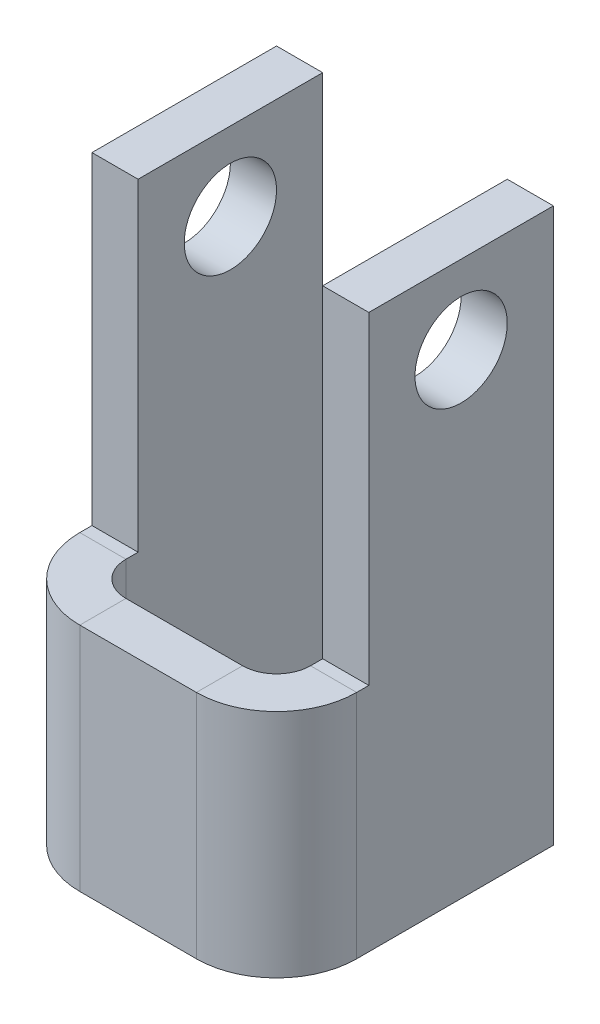
ISO-10303-21;
HEADER;
FILE_DESCRIPTION(('STEP AP214'),'2;1');
FILE_NAME('part.step','',(''),(''),'','','');
FILE_SCHEMA(('AUTOMOTIVE_DESIGN { 1 0 10303 214 1 1 1 1 }'));
ENDSEC;
DATA;
#1=APPLICATION_CONTEXT('core data for automotive mechanical design processes');
#2=APPLICATION_PROTOCOL_DEFINITION('international standard','automotive_design',2000,#1);
#3=PRODUCT_CONTEXT('',#1,'mechanical');
#4=PRODUCT('Part','Part','',(#3));
#5=PRODUCT_RELATED_PRODUCT_CATEGORY('part','',(#4));
#6=PRODUCT_DEFINITION_FORMATION('','',#4);
#7=PRODUCT_DEFINITION_CONTEXT('part definition',#1,'design');
#8=PRODUCT_DEFINITION('design','',#6,#7);
#9=PRODUCT_DEFINITION_SHAPE('','',#8);
#10=(LENGTH_UNIT() NAMED_UNIT(*) SI_UNIT(.MILLI.,.METRE.));
#11=(NAMED_UNIT(*) PLANE_ANGLE_UNIT() SI_UNIT($,.RADIAN.));
#12=(NAMED_UNIT(*) SI_UNIT($,.STERADIAN.) SOLID_ANGLE_UNIT());
#13=UNCERTAINTY_MEASURE_WITH_UNIT(LENGTH_MEASURE(1.E-05),#10,'distance_accuracy_value','');
#14=(GEOMETRIC_REPRESENTATION_CONTEXT(3) GLOBAL_UNCERTAINTY_ASSIGNED_CONTEXT((#13)) GLOBAL_UNIT_ASSIGNED_CONTEXT((#10,
#11,#12)) REPRESENTATION_CONTEXT('',''));
#15=CARTESIAN_POINT('',(0.,0.,0.));
#16=DIRECTION('',(0.,0.,1.));
#17=DIRECTION('',(1.,0.,0.));
#18=AXIS2_PLACEMENT_3D('',#15,#16,#17);
#19=CARTESIAN_POINT('',(-4.,5.,-2.00000000000003));
#20=DIRECTION('',(0.,-1.,0.));
#21=DIRECTION('',(0.,0.,-1.));
#22=AXIS2_PLACEMENT_3D('',#19,#20,#21);
#23=PLANE('',#22);
#24=DIRECTION('',(0.,0.,-1.));
#25=VECTOR('',#24,1.);
#26=CARTESIAN_POINT('',(0.,5.,0.));
#27=LINE('',#26,#25);
#28=CARTESIAN_POINT('',(0.,5.,-1.73659999999999));
#29=VERTEX_POINT('',#28);
#30=CARTESIAN_POINT('',(0.,5.,-2.00000000000001));
#31=VERTEX_POINT('',#30);
#32=EDGE_CURVE('E288',#29,#31,#27,.T.);
#33=ORIENTED_EDGE('',*,*,#32,.F.);
#34=DIRECTION('',(1.,0.,0.));
#35=VECTOR('',#34,1.);
#36=CARTESIAN_POINT('',(0.,5.,-1.73659999999999));
#37=LINE('',#36,#35);
#38=CARTESIAN_POINT('',(0.999999999999997,5.,-1.7366));
#39=VERTEX_POINT('',#38);
#40=EDGE_CURVE('E13',#29,#39,#37,.T.);
#41=ORIENTED_EDGE('',*,*,#40,.T.);
#42=DIRECTION('',(0.,0.,-1.));
#43=VECTOR('',#42,1.);
#44=CARTESIAN_POINT('',(1.,5.,0.));
#45=LINE('',#44,#43);
#46=CARTESIAN_POINT('',(0.999999999999997,5.,-2.00000000000001));
#47=VERTEX_POINT('',#46);
#48=EDGE_CURVE('E259',#39,#47,#45,.T.);
#49=ORIENTED_EDGE('',*,*,#48,.T.);
#50=DIRECTION('',(1.,0.,0.));
#51=VECTOR('',#50,1.);
#52=CARTESIAN_POINT('',(-4.,5.,-2.00000000000003));
#53=LINE('',#52,#51);
#54=EDGE_CURVE('E388',#31,#47,#53,.T.);
#55=ORIENTED_EDGE('',*,*,#54,.F.);
#56=EDGE_LOOP('',(#33,#41,#49,#55));
#57=FACE_BOUND('',#56,.T.);
#58=ADVANCED_FACE('F80',(#57),#23,.F.);
#59=DIRECTION('',(-1.,0.,0.));
#60=VECTOR('',#59,1.);
#61=CARTESIAN_POINT('',(0.,5.,-1.));
#62=LINE('',#61,#60);
#63=CARTESIAN_POINT('',(4.2634,5.,-1.));
#64=VERTEX_POINT('',#63);
#65=CARTESIAN_POINT('',(1.7366,5.,-1.));
#66=VERTEX_POINT('',#65);
#67=EDGE_CURVE('E278',#64,#66,#62,.T.);
#68=ORIENTED_EDGE('',*,*,#67,.T.);
#69=DIRECTION('',(0.,0.,1.));
#70=VECTOR('',#69,1.);
#71=CARTESIAN_POINT('',(1.7366,5.,-1.));
#72=LINE('',#71,#70);
#73=CARTESIAN_POINT('',(1.73659999999999,5.,0.));
#74=VERTEX_POINT('',#73);
#75=EDGE_CURVE('E89',#66,#74,#72,.T.);
#76=ORIENTED_EDGE('',*,*,#75,.T.);
#77=DIRECTION('',(1.,0.,0.));
#78=VECTOR('',#77,1.);
#79=CARTESIAN_POINT('',(-4.,5.,0.));
#80=LINE('',#79,#78);
#81=CARTESIAN_POINT('',(4.2634,5.,0.));
#82=VERTEX_POINT('',#81);
#83=EDGE_CURVE('E275',#74,#82,#80,.T.);
#84=ORIENTED_EDGE('',*,*,#83,.T.);
#85=DIRECTION('',(0.,0.,-1.));
#86=VECTOR('',#85,1.);
#87=CARTESIAN_POINT('',(4.2634,5.,0.));
#88=LINE('',#87,#86);
#89=EDGE_CURVE('E265',#82,#64,#88,.T.);
#90=ORIENTED_EDGE('',*,*,#89,.T.);
#91=EDGE_LOOP('',(#68,#76,#84,#90));
#92=FACE_BOUND('',#91,.T.);
#93=ADVANCED_FACE('F273',(#92),#23,.F.);
#94=DIRECTION('',(0.,0.,1.));
#95=VECTOR('',#94,1.);
#96=CARTESIAN_POINT('',(5.,5.,0.));
#97=LINE('',#96,#95);
#98=CARTESIAN_POINT('',(5.,5.,-2.));
#99=VERTEX_POINT('',#98);
#100=CARTESIAN_POINT('',(5.,5.,-1.7366));
#101=VERTEX_POINT('',#100);
#102=EDGE_CURVE('E329',#99,#101,#97,.T.);
#103=ORIENTED_EDGE('',*,*,#102,.T.);
#104=DIRECTION('',(1.,0.,0.));
#105=VECTOR('',#104,1.);
#106=CARTESIAN_POINT('',(5.,5.,-1.7366));
#107=LINE('',#106,#105);
#108=CARTESIAN_POINT('',(6.,5.,-1.73659999999999));
#109=VERTEX_POINT('',#108);
#110=EDGE_CURVE('E267',#101,#109,#107,.T.);
#111=ORIENTED_EDGE('',*,*,#110,.T.);
#112=DIRECTION('',(0.,0.,-1.));
#113=VECTOR('',#112,1.);
#114=CARTESIAN_POINT('',(6.,5.,-1.99999999999999));
#115=LINE('',#114,#113);
#116=CARTESIAN_POINT('',(6.,5.,-1.99999999999999));
#117=VERTEX_POINT('',#116);
#118=EDGE_CURVE('E203',#109,#117,#115,.T.);
#119=ORIENTED_EDGE('',*,*,#118,.T.);
#120=EDGE_CURVE('E198',#99,#117,#53,.T.);
#121=ORIENTED_EDGE('',*,*,#120,.F.);
#122=EDGE_LOOP('',(#103,#111,#119,#121));
#123=FACE_BOUND('',#122,.T.);
#124=ADVANCED_FACE('F429',(#123),#23,.F.);
#125=ORIENTED_EDGE('',*,*,#40,.F.);
#126=CARTESIAN_POINT('',(1.7366,5.,-1.7366));
#127=DIRECTION('',(0.,-1.,0.));
#128=DIRECTION('',(0.,0.,-1.));
#129=AXIS2_PLACEMENT_3D('',#126,#127,#128);
#130=CIRCLE('',#129,1.7366);
#131=EDGE_CURVE('E282',#29,#74,#130,.F.);
#132=ORIENTED_EDGE('',*,*,#131,.T.);
#133=ORIENTED_EDGE('',*,*,#75,.F.);
#134=CARTESIAN_POINT('',(1.7366,5.,-1.7366));
#135=DIRECTION('',(0.,-1.,0.));
#136=DIRECTION('',(0.,0.,-1.));
#137=AXIS2_PLACEMENT_3D('',#134,#135,#136);
#138=CIRCLE('',#137,0.7366);
#139=EDGE_CURVE('E362',#39,#66,#138,.F.);
#140=ORIENTED_EDGE('',*,*,#139,.F.);
#141=EDGE_LOOP('',(#125,#132,#133,#140));
#142=FACE_BOUND('',#141,.T.);
#143=ADVANCED_FACE('F283',(#142),#23,.F.);
#144=CARTESIAN_POINT('',(0.,0.,-1.));
#145=DIRECTION('',(0.,0.,-1.));
#146=DIRECTION('',(-1.,0.,0.));
#147=AXIS2_PLACEMENT_3D('',#144,#145,#146);
#148=PLANE('',#147);
#149=ORIENTED_EDGE('',*,*,#67,.F.);
#150=DIRECTION('',(0.,-1.,0.));
#151=VECTOR('',#150,1.);
#152=CARTESIAN_POINT('',(4.2634,0.,-0.999999999999999));
#153=LINE('',#152,#151);
#154=CARTESIAN_POINT('',(4.2634,0.,-1.));
#155=VERTEX_POINT('',#154);
#156=EDGE_CURVE('E250',#155,#64,#153,.F.);
#157=ORIENTED_EDGE('',*,*,#156,.F.);
#158=DIRECTION('',(1.,0.,0.));
#159=VECTOR('',#158,1.);
#160=CARTESIAN_POINT('',(0.,0.,-1.));
#161=LINE('',#160,#159);
#162=CARTESIAN_POINT('',(1.7366,0.,-1.));
#163=VERTEX_POINT('',#162);
#164=EDGE_CURVE('E102',#163,#155,#161,.T.);
#165=ORIENTED_EDGE('',*,*,#164,.F.);
#166=DIRECTION('',(0.,1.,0.));
#167=VECTOR('',#166,1.);
#168=CARTESIAN_POINT('',(1.7366,12.,-1.));
#169=LINE('',#168,#167);
#170=EDGE_CURVE('E304',#66,#163,#169,.F.);
#171=ORIENTED_EDGE('',*,*,#170,.F.);
#172=EDGE_LOOP('',(#149,#157,#165,#171));
#173=FACE_BOUND('',#172,.T.);
#174=ADVANCED_FACE('F411',(#173),#148,.T.);
#175=CARTESIAN_POINT('',(0.,0.,0.));
#176=DIRECTION('',(0.,0.,-1.));
#177=DIRECTION('',(-1.,0.,0.));
#178=AXIS2_PLACEMENT_3D('',#175,#176,#177);
#179=PLANE('',#178);
#180=DIRECTION('',(0.,-1.,0.));
#181=VECTOR('',#180,1.);
#182=CARTESIAN_POINT('',(4.2634,0.,0.));
#183=LINE('',#182,#181);
#184=CARTESIAN_POINT('',(4.2634,0.,0.));
#185=VERTEX_POINT('',#184);
#186=EDGE_CURVE('E243',#185,#82,#183,.F.);
#187=ORIENTED_EDGE('',*,*,#186,.T.);
#188=ORIENTED_EDGE('',*,*,#83,.F.);
#189=DIRECTION('',(0.,1.,0.));
#190=VECTOR('',#189,1.);
#191=CARTESIAN_POINT('',(1.7366,12.,0.));
#192=LINE('',#191,#190);
#193=CARTESIAN_POINT('',(1.7366,0.,0.));
#194=VERTEX_POINT('',#193);
#195=EDGE_CURVE('E292',#74,#194,#192,.F.);
#196=ORIENTED_EDGE('',*,*,#195,.T.);
#197=DIRECTION('',(1.,0.,0.));
#198=VECTOR('',#197,1.);
#199=CARTESIAN_POINT('',(0.,0.,0.));
#200=LINE('',#199,#198);
#201=EDGE_CURVE('E257',#194,#185,#200,.T.);
#202=ORIENTED_EDGE('',*,*,#201,.T.);
#203=EDGE_LOOP('',(#187,#188,#196,#202));
#204=FACE_BOUND('',#203,.T.);
#205=ADVANCED_FACE('F291',(#204),#179,.F.);
#206=CARTESIAN_POINT('',(0.,0.,-1.));
#207=DIRECTION('',(0.,-1.,0.));
#208=DIRECTION('',(0.,0.,-1.));
#209=AXIS2_PLACEMENT_3D('',#206,#207,#208);
#210=PLANE('',#209);
#211=DIRECTION('',(0.,0.,1.));
#212=VECTOR('',#211,1.);
#213=CARTESIAN_POINT('',(1.7366,0.,-1.));
#214=LINE('',#213,#212);
#215=EDGE_CURVE('E242',#163,#194,#214,.T.);
#216=ORIENTED_EDGE('',*,*,#215,.F.);
#217=ORIENTED_EDGE('',*,*,#164,.T.);
#218=DIRECTION('',(0.,0.,1.));
#219=VECTOR('',#218,1.);
#220=CARTESIAN_POINT('',(4.2634,0.,-0.999999999999999));
#221=LINE('',#220,#219);
#222=EDGE_CURVE('E246',#155,#185,#221,.T.);
#223=ORIENTED_EDGE('',*,*,#222,.T.);
#224=ORIENTED_EDGE('',*,*,#201,.F.);
#225=EDGE_LOOP('',(#216,#217,#223,#224));
#226=FACE_BOUND('',#225,.T.);
#227=ADVANCED_FACE('F82',(#226),#210,.T.);
#228=CARTESIAN_POINT('',(4.2634,0.,-1.7366));
#229=DIRECTION('',(0.,1.,0.));
#230=DIRECTION('',(0.,0.,1.));
#231=AXIS2_PLACEMENT_3D('',#228,#229,#230);
#232=PLANE('',#231);
#233=CARTESIAN_POINT('',(4.2634,0.,-1.7366));
#234=DIRECTION('',(0.,-1.,0.));
#235=DIRECTION('',(0.,0.,-1.));
#236=AXIS2_PLACEMENT_3D('',#233,#234,#235);
#237=CIRCLE('',#236,0.7366);
#238=CARTESIAN_POINT('',(5.,0.,-1.7366));
#239=VERTEX_POINT('',#238);
#240=EDGE_CURVE('E253',#239,#155,#237,.T.);
#241=ORIENTED_EDGE('',*,*,#240,.F.);
#242=DIRECTION('',(-1.,0.,0.));
#243=VECTOR('',#242,1.);
#244=CARTESIAN_POINT('',(5.,0.,-1.7366));
#245=LINE('',#244,#243);
#246=CARTESIAN_POINT('',(6.,0.,-1.73659999999999));
#247=VERTEX_POINT('',#246);
#248=EDGE_CURVE('E237',#239,#247,#245,.F.);
#249=ORIENTED_EDGE('',*,*,#248,.T.);
#250=CARTESIAN_POINT('',(4.2634,0.,-1.7366));
#251=DIRECTION('',(0.,-1.,0.));
#252=DIRECTION('',(0.,0.,-1.));
#253=AXIS2_PLACEMENT_3D('',#250,#251,#252);
#254=CIRCLE('',#253,1.7366);
#255=EDGE_CURVE('E247',#247,#185,#254,.T.);
#256=ORIENTED_EDGE('',*,*,#255,.T.);
#257=ORIENTED_EDGE('',*,*,#222,.F.);
#258=EDGE_LOOP('',(#241,#249,#256,#257));
#259=FACE_BOUND('',#258,.T.);
#260=ADVANCED_FACE('F407',(#259),#232,.F.);
#261=CARTESIAN_POINT('',(4.2634,0.,-1.7366));
#262=DIRECTION('',(0.,-1.,0.));
#263=DIRECTION('',(1.,0.,0.));
#264=AXIS2_PLACEMENT_3D('',#261,#262,#263);
#265=CYLINDRICAL_SURFACE('',#264,1.7366);
#266=CARTESIAN_POINT('',(4.2634,5.,-1.7366));
#267=DIRECTION('',(0.,-1.,0.));
#268=DIRECTION('',(0.,0.,-1.));
#269=AXIS2_PLACEMENT_3D('',#266,#267,#268);
#270=CIRCLE('',#269,1.7366);
#271=EDGE_CURVE('E287',#82,#109,#270,.F.);
#272=ORIENTED_EDGE('',*,*,#271,.F.);
#273=ORIENTED_EDGE('',*,*,#186,.F.);
#274=ORIENTED_EDGE('',*,*,#255,.F.);
#275=DIRECTION('',(0.,-1.,0.));
#276=VECTOR('',#275,1.);
#277=CARTESIAN_POINT('',(6.,12.,-1.73659999999999));
#278=LINE('',#277,#276);
#279=EDGE_CURVE('E234',#247,#109,#278,.F.);
#280=ORIENTED_EDGE('',*,*,#279,.T.);
#281=EDGE_LOOP('',(#272,#273,#274,#280));
#282=FACE_BOUND('',#281,.T.);
#283=ADVANCED_FACE('F403',(#282),#265,.T.);
#284=CARTESIAN_POINT('',(4.2634,0.,-1.7366));
#285=DIRECTION('',(0.,-1.,0.));
#286=DIRECTION('',(1.,0.,0.));
#287=AXIS2_PLACEMENT_3D('',#284,#285,#286);
#288=CYLINDRICAL_SURFACE('',#287,0.7366);
#289=ORIENTED_EDGE('',*,*,#156,.T.);
#290=CARTESIAN_POINT('',(4.2634,5.,-1.7366));
#291=DIRECTION('',(0.,-1.,0.));
#292=DIRECTION('',(0.,0.,-1.));
#293=AXIS2_PLACEMENT_3D('',#290,#291,#292);
#294=CIRCLE('',#293,0.7366);
#295=EDGE_CURVE('E390',#64,#101,#294,.F.);
#296=ORIENTED_EDGE('',*,*,#295,.T.);
#297=DIRECTION('',(0.,-1.,0.));
#298=VECTOR('',#297,1.);
#299=CARTESIAN_POINT('',(5.,12.,-1.7366));
#300=LINE('',#299,#298);
#301=EDGE_CURVE('E240',#101,#239,#300,.T.);
#302=ORIENTED_EDGE('',*,*,#301,.T.);
#303=ORIENTED_EDGE('',*,*,#240,.T.);
#304=EDGE_LOOP('',(#289,#296,#302,#303));
#305=FACE_BOUND('',#304,.T.);
#306=ADVANCED_FACE('F409',(#305),#288,.F.);
#307=CARTESIAN_POINT('',(6.00000000000002,0.,-6.));
#308=DIRECTION('',(0.,1.,0.));
#309=DIRECTION('',(0.,0.,1.));
#310=AXIS2_PLACEMENT_3D('',#307,#308,#309);
#311=PLANE('',#310);
#312=ORIENTED_EDGE('',*,*,#248,.F.);
#313=DIRECTION('',(0.,0.,1.));
#314=VECTOR('',#313,1.);
#315=CARTESIAN_POINT('',(5.00000000000002,0.,-6.));
#316=LINE('',#315,#314);
#317=CARTESIAN_POINT('',(5.00000000000002,0.,-6.));
#318=VERTEX_POINT('',#317);
#319=EDGE_CURVE('E232',#239,#318,#316,.F.);
#320=ORIENTED_EDGE('',*,*,#319,.T.);
#321=DIRECTION('',(-1.,0.,0.));
#322=VECTOR('',#321,1.);
#323=CARTESIAN_POINT('',(6.00000000000002,0.,-6.));
#324=LINE('',#323,#322);
#325=CARTESIAN_POINT('',(6.00000000000002,0.,-6.));
#326=VERTEX_POINT('',#325);
#327=EDGE_CURVE('E222',#326,#318,#324,.T.);
#328=ORIENTED_EDGE('',*,*,#327,.F.);
#329=DIRECTION('',(0.,0.,-1.));
#330=VECTOR('',#329,1.);
#331=CARTESIAN_POINT('',(6.,0.,0.));
#332=LINE('',#331,#330);
#333=EDGE_CURVE('E224',#247,#326,#332,.T.);
#334=ORIENTED_EDGE('',*,*,#333,.F.);
#335=EDGE_LOOP('',(#312,#320,#328,#334));
#336=FACE_BOUND('',#335,.T.);
#337=ADVANCED_FACE('F321',(#336),#311,.F.);
#338=CARTESIAN_POINT('',(6.,12.,-0.999999999999997));
#339=DIRECTION('',(0.,-1.,0.));
#340=DIRECTION('',(0.,0.,-1.));
#341=AXIS2_PLACEMENT_3D('',#338,#339,#340);
#342=PLANE('',#341);
#343=DIRECTION('',(0.,0.,-1.));
#344=VECTOR('',#343,1.);
#345=CARTESIAN_POINT('',(5.,12.,-1.));
#346=LINE('',#345,#344);
#347=CARTESIAN_POINT('',(5.00000000000002,12.,-6.));
#348=VERTEX_POINT('',#347);
#349=CARTESIAN_POINT('',(5.,12.,-2.));
#350=VERTEX_POINT('',#349);
#351=EDGE_CURVE('E213',#348,#350,#346,.F.);
#352=ORIENTED_EDGE('',*,*,#351,.T.);
#353=DIRECTION('',(1.,0.,0.));
#354=VECTOR('',#353,1.);
#355=CARTESIAN_POINT('',(-4.,12.,-2.00000000000003));
#356=LINE('',#355,#354);
#357=CARTESIAN_POINT('',(6.,12.,-1.99999999999999));
#358=VERTEX_POINT('',#357);
#359=EDGE_CURVE('E195',#350,#358,#356,.T.);
#360=ORIENTED_EDGE('',*,*,#359,.T.);
#361=DIRECTION('',(0.,0.,1.));
#362=VECTOR('',#361,1.);
#363=CARTESIAN_POINT('',(6.,12.,0.));
#364=LINE('',#363,#362);
#365=CARTESIAN_POINT('',(6.00000000000002,12.,-6.));
#366=VERTEX_POINT('',#365);
#367=EDGE_CURVE('E211',#366,#358,#364,.T.);
#368=ORIENTED_EDGE('',*,*,#367,.F.);
#369=DIRECTION('',(-1.,0.,0.));
#370=VECTOR('',#369,1.);
#371=CARTESIAN_POINT('',(6.00000000000002,12.,-6.));
#372=LINE('',#371,#370);
#373=EDGE_CURVE('E220',#366,#348,#372,.T.);
#374=ORIENTED_EDGE('',*,*,#373,.T.);
#375=EDGE_LOOP('',(#352,#360,#368,#374));
#376=FACE_BOUND('',#375,.T.);
#377=ADVANCED_FACE('F209',(#376),#342,.F.);
#378=CARTESIAN_POINT('',(6.,0.,0.));
#379=DIRECTION('',(-1.,0.,0.));
#380=DIRECTION('',(0.,0.,1.));
#381=AXIS2_PLACEMENT_3D('',#378,#379,#380);
#382=PLANE('',#381);
#383=CARTESIAN_POINT('',(6.00000000000001,10.3,-4.));
#384=DIRECTION('',(1.,0.,0.));
#385=DIRECTION('',(0.,0.,-1.));
#386=AXIS2_PLACEMENT_3D('',#383,#384,#385);
#387=CIRCLE('',#386,1.);
#388=CARTESIAN_POINT('',(6.00000000000001,10.3,-5.));
#389=VERTEX_POINT('',#388);
#390=EDGE_CURVE('E456',#389,#389,#387,.T.);
#391=ORIENTED_EDGE('',*,*,#390,.F.);
#392=EDGE_LOOP('',(#391));
#393=FACE_BOUND('',#392,.T.);
#394=ORIENTED_EDGE('',*,*,#367,.T.);
#395=DIRECTION('',(0.,1.,0.));
#396=VECTOR('',#395,1.);
#397=CARTESIAN_POINT('',(6.,12.,-1.99999999999999));
#398=LINE('',#397,#396);
#399=EDGE_CURVE('E192',#117,#358,#398,.T.);
#400=ORIENTED_EDGE('',*,*,#399,.F.);
#401=ORIENTED_EDGE('',*,*,#118,.F.);
#402=ORIENTED_EDGE('',*,*,#279,.F.);
#403=ORIENTED_EDGE('',*,*,#333,.T.);
#404=DIRECTION('',(0.,1.,0.));
#405=VECTOR('',#404,1.);
#406=CARTESIAN_POINT('',(6.00000000000002,0.,-6.));
#407=LINE('',#406,#405);
#408=EDGE_CURVE('E218',#326,#366,#407,.T.);
#409=ORIENTED_EDGE('',*,*,#408,.T.);
#410=EDGE_LOOP('',(#394,#400,#401,#402,#403,#409));
#411=FACE_BOUND('',#410,.T.);
#412=ADVANCED_FACE('F216',(#393,#411),#382,.F.);
#413=CARTESIAN_POINT('',(5.,0.,0.));
#414=DIRECTION('',(-1.,0.,0.));
#415=DIRECTION('',(0.,0.,1.));
#416=AXIS2_PLACEMENT_3D('',#413,#414,#415);
#417=PLANE('',#416);
#418=CARTESIAN_POINT('',(5.00000000000001,10.3,-4.));
#419=DIRECTION('',(-1.,0.,0.));
#420=DIRECTION('',(0.,0.,1.));
#421=AXIS2_PLACEMENT_3D('',#418,#419,#420);
#422=CIRCLE('',#421,1.);
#423=CARTESIAN_POINT('',(5.00000000000001,10.3,-3.));
#424=VERTEX_POINT('',#423);
#425=EDGE_CURVE('E204',#424,#424,#422,.T.);
#426=ORIENTED_EDGE('',*,*,#425,.F.);
#427=EDGE_LOOP('',(#426));
#428=FACE_BOUND('',#427,.T.);
#429=DIRECTION('',(0.,-1.,0.));
#430=VECTOR('',#429,1.);
#431=CARTESIAN_POINT('',(5.,0.,-2.));
#432=LINE('',#431,#430);
#433=EDGE_CURVE('E327',#350,#99,#432,.T.);
#434=ORIENTED_EDGE('',*,*,#433,.F.);
#435=ORIENTED_EDGE('',*,*,#351,.F.);
#436=DIRECTION('',(0.,-1.,0.));
#437=VECTOR('',#436,1.);
#438=CARTESIAN_POINT('',(5.00000000000002,12.,-6.));
#439=LINE('',#438,#437);
#440=EDGE_CURVE('E230',#318,#348,#439,.F.);
#441=ORIENTED_EDGE('',*,*,#440,.F.);
#442=ORIENTED_EDGE('',*,*,#319,.F.);
#443=ORIENTED_EDGE('',*,*,#301,.F.);
#444=ORIENTED_EDGE('',*,*,#102,.F.);
#445=EDGE_LOOP('',(#434,#435,#441,#442,#443,#444));
#446=FACE_BOUND('',#445,.T.);
#447=ADVANCED_FACE('F325',(#428,#446),#417,.T.);
#448=CARTESIAN_POINT('',(6.00000000000002,12.,-6.));
#449=DIRECTION('',(0.,0.,1.));
#450=DIRECTION('',(1.,0.,0.));
#451=AXIS2_PLACEMENT_3D('',#448,#449,#450);
#452=PLANE('',#451);
#453=ORIENTED_EDGE('',*,*,#440,.T.);
#454=ORIENTED_EDGE('',*,*,#373,.F.);
#455=ORIENTED_EDGE('',*,*,#408,.F.);
#456=ORIENTED_EDGE('',*,*,#327,.T.);
#457=EDGE_LOOP('',(#453,#454,#455,#456));
#458=FACE_BOUND('',#457,.T.);
#459=ADVANCED_FACE('F316',(#458),#452,.F.);
#460=CARTESIAN_POINT('',(1.7366,0.,-1.7366));
#461=DIRECTION('',(0.,-1.,0.));
#462=DIRECTION('',(0.,0.,-1.));
#463=AXIS2_PLACEMENT_3D('',#460,#461,#462);
#464=PLANE('',#463);
#465=DIRECTION('',(1.,0.,0.));
#466=VECTOR('',#465,1.);
#467=CARTESIAN_POINT('',(0.,0.,-1.73659999999999));
#468=LINE('',#467,#466);
#469=CARTESIAN_POINT('',(0.999999999999997,0.,-1.7366));
#470=VERTEX_POINT('',#469);
#471=CARTESIAN_POINT('',(0.,0.,-1.73659999999999));
#472=VERTEX_POINT('',#471);
#473=EDGE_CURVE('E307',#470,#472,#468,.F.);
#474=ORIENTED_EDGE('',*,*,#473,.F.);
#475=CARTESIAN_POINT('',(1.7366,0.,-1.7366));
#476=DIRECTION('',(0.,1.,0.));
#477=DIRECTION('',(0.,0.,1.));
#478=AXIS2_PLACEMENT_3D('',#475,#476,#477);
#479=CIRCLE('',#478,0.7366);
#480=EDGE_CURVE('E300',#163,#470,#479,.F.);
#481=ORIENTED_EDGE('',*,*,#480,.F.);
#482=ORIENTED_EDGE('',*,*,#215,.T.);
#483=CARTESIAN_POINT('',(1.7366,0.,-1.7366));
#484=DIRECTION('',(0.,1.,0.));
#485=DIRECTION('',(0.,0.,1.));
#486=AXIS2_PLACEMENT_3D('',#483,#484,#485);
#487=CIRCLE('',#486,1.7366);
#488=EDGE_CURVE('E299',#194,#472,#487,.F.);
#489=ORIENTED_EDGE('',*,*,#488,.T.);
#490=EDGE_LOOP('',(#474,#481,#482,#489));
#491=FACE_BOUND('',#490,.T.);
#492=ADVANCED_FACE('F413',(#491),#464,.T.);
#493=CARTESIAN_POINT('',(1.7366,12.,-1.7366));
#494=DIRECTION('',(0.,1.,0.));
#495=DIRECTION('',(-1.,0.,0.));
#496=AXIS2_PLACEMENT_3D('',#493,#494,#495);
#497=CYLINDRICAL_SURFACE('',#496,1.7366);
#498=ORIENTED_EDGE('',*,*,#131,.F.);
#499=DIRECTION('',(0.,1.,0.));
#500=VECTOR('',#499,1.);
#501=CARTESIAN_POINT('',(0.,0.,-1.73659999999999));
#502=LINE('',#501,#500);
#503=EDGE_CURVE('E357',#29,#472,#502,.F.);
#504=ORIENTED_EDGE('',*,*,#503,.T.);
#505=ORIENTED_EDGE('',*,*,#488,.F.);
#506=ORIENTED_EDGE('',*,*,#195,.F.);
#507=EDGE_LOOP('',(#498,#504,#505,#506));
#508=FACE_BOUND('',#507,.T.);
#509=ADVANCED_FACE('F297',(#508),#497,.T.);
#510=CARTESIAN_POINT('',(1.7366,12.,-1.7366));
#511=DIRECTION('',(0.,1.,0.));
#512=DIRECTION('',(-1.,0.,0.));
#513=AXIS2_PLACEMENT_3D('',#510,#511,#512);
#514=CYLINDRICAL_SURFACE('',#513,0.7366);
#515=DIRECTION('',(0.,1.,0.));
#516=VECTOR('',#515,1.);
#517=CARTESIAN_POINT('',(0.999999999999997,0.,-1.7366));
#518=LINE('',#517,#516);
#519=EDGE_CURVE('E333',#470,#39,#518,.T.);
#520=ORIENTED_EDGE('',*,*,#519,.T.);
#521=ORIENTED_EDGE('',*,*,#139,.T.);
#522=ORIENTED_EDGE('',*,*,#170,.T.);
#523=ORIENTED_EDGE('',*,*,#480,.T.);
#524=EDGE_LOOP('',(#520,#521,#522,#523));
#525=FACE_BOUND('',#524,.T.);
#526=ADVANCED_FACE('F361',(#525),#514,.F.);
#527=CARTESIAN_POINT('',(0.,12.,-6.));
#528=DIRECTION('',(0.,-1.,0.));
#529=DIRECTION('',(0.,0.,-1.));
#530=AXIS2_PLACEMENT_3D('',#527,#528,#529);
#531=PLANE('',#530);
#532=DIRECTION('',(0.,0.,-1.));
#533=VECTOR('',#532,1.);
#534=CARTESIAN_POINT('',(0.,12.,0.));
#535=LINE('',#534,#533);
#536=CARTESIAN_POINT('',(0.,12.,-2.00000000000001));
#537=VERTEX_POINT('',#536);
#538=CARTESIAN_POINT('',(0.,12.,-6.));
#539=VERTEX_POINT('',#538);
#540=EDGE_CURVE('E348',#537,#539,#535,.T.);
#541=ORIENTED_EDGE('',*,*,#540,.F.);
#542=CARTESIAN_POINT('',(0.999999999999997,12.,-2.00000000000001));
#543=VERTEX_POINT('',#542);
#544=EDGE_CURVE('E214',#537,#543,#356,.T.);
#545=ORIENTED_EDGE('',*,*,#544,.T.);
#546=DIRECTION('',(0.,0.,1.));
#547=VECTOR('',#546,1.);
#548=CARTESIAN_POINT('',(0.999999999999982,12.,-6.));
#549=LINE('',#548,#547);
#550=CARTESIAN_POINT('',(0.999999999999982,12.,-6.));
#551=VERTEX_POINT('',#550);
#552=EDGE_CURVE('E355',#543,#551,#549,.F.);
#553=ORIENTED_EDGE('',*,*,#552,.T.);
#554=DIRECTION('',(1.,0.,0.));
#555=VECTOR('',#554,1.);
#556=CARTESIAN_POINT('',(0.,12.,-6.));
#557=LINE('',#556,#555);
#558=EDGE_CURVE('E311',#539,#551,#557,.T.);
#559=ORIENTED_EDGE('',*,*,#558,.F.);
#560=EDGE_LOOP('',(#541,#545,#553,#559));
#561=FACE_BOUND('',#560,.T.);
#562=ADVANCED_FACE('F383',(#561),#531,.F.);
#563=CARTESIAN_POINT('',(0.,0.,-0.999999999999997));
#564=DIRECTION('',(0.,1.,0.));
#565=DIRECTION('',(0.,0.,1.));
#566=AXIS2_PLACEMENT_3D('',#563,#564,#565);
#567=PLANE('',#566);
#568=ORIENTED_EDGE('',*,*,#473,.T.);
#569=DIRECTION('',(0.,0.,1.));
#570=VECTOR('',#569,1.);
#571=CARTESIAN_POINT('',(0.,0.,0.));
#572=LINE('',#571,#570);
#573=CARTESIAN_POINT('',(0.,0.,-6.));
#574=VERTEX_POINT('',#573);
#575=EDGE_CURVE('E343',#574,#472,#572,.T.);
#576=ORIENTED_EDGE('',*,*,#575,.F.);
#577=DIRECTION('',(1.,0.,0.));
#578=VECTOR('',#577,1.);
#579=CARTESIAN_POINT('',(0.,0.,-6.));
#580=LINE('',#579,#578);
#581=CARTESIAN_POINT('',(0.999999999999982,0.,-6.));
#582=VERTEX_POINT('',#581);
#583=EDGE_CURVE('E340',#574,#582,#580,.T.);
#584=ORIENTED_EDGE('',*,*,#583,.T.);
#585=DIRECTION('',(0.,0.,-1.));
#586=VECTOR('',#585,1.);
#587=CARTESIAN_POINT('',(1.,0.,-1.));
#588=LINE('',#587,#586);
#589=EDGE_CURVE('E350',#582,#470,#588,.F.);
#590=ORIENTED_EDGE('',*,*,#589,.T.);
#591=EDGE_LOOP('',(#568,#576,#584,#590));
#592=FACE_BOUND('',#591,.T.);
#593=ADVANCED_FACE('F372',(#592),#567,.F.);
#594=CARTESIAN_POINT('',(0.,0.,0.));
#595=DIRECTION('',(1.,0.,0.));
#596=DIRECTION('',(0.,0.,-1.));
#597=AXIS2_PLACEMENT_3D('',#594,#595,#596);
#598=PLANE('',#597);
#599=CARTESIAN_POINT('',(0.,10.3,-4.00000000000002));
#600=DIRECTION('',(1.,0.,0.));
#601=DIRECTION('',(0.,0.,-1.));
#602=AXIS2_PLACEMENT_3D('',#599,#600,#601);
#603=CIRCLE('',#602,1.);
#604=CARTESIAN_POINT('',(0.,10.3,-5.00000000000002));
#605=VERTEX_POINT('',#604);
#606=EDGE_CURVE('E453',#605,#605,#603,.F.);
#607=ORIENTED_EDGE('',*,*,#606,.F.);
#608=EDGE_LOOP('',(#607));
#609=FACE_BOUND('',#608,.T.);
#610=ORIENTED_EDGE('',*,*,#32,.T.);
#611=DIRECTION('',(0.,1.,0.));
#612=VECTOR('',#611,1.);
#613=CARTESIAN_POINT('',(0.,0.,-2.00000000000002));
#614=LINE('',#613,#612);
#615=EDGE_CURVE('E330',#31,#537,#614,.T.);
#616=ORIENTED_EDGE('',*,*,#615,.T.);
#617=ORIENTED_EDGE('',*,*,#540,.T.);
#618=DIRECTION('',(0.,-1.,0.));
#619=VECTOR('',#618,1.);
#620=CARTESIAN_POINT('',(0.,0.,-6.));
#621=LINE('',#620,#619);
#622=EDGE_CURVE('E346',#539,#574,#621,.T.);
#623=ORIENTED_EDGE('',*,*,#622,.T.);
#624=ORIENTED_EDGE('',*,*,#575,.T.);
#625=ORIENTED_EDGE('',*,*,#503,.F.);
#626=EDGE_LOOP('',(#610,#616,#617,#623,#624,#625));
#627=FACE_BOUND('',#626,.T.);
#628=ADVANCED_FACE('F573',(#609,#627),#598,.F.);
#629=CARTESIAN_POINT('',(1.,0.,0.));
#630=DIRECTION('',(1.,0.,0.));
#631=DIRECTION('',(0.,0.,-1.));
#632=AXIS2_PLACEMENT_3D('',#629,#630,#631);
#633=PLANE('',#632);
#634=CARTESIAN_POINT('',(0.99999999999999,10.3,-4.00000000000001));
#635=DIRECTION('',(1.,0.,0.));
#636=DIRECTION('',(0.,0.,-1.));
#637=AXIS2_PLACEMENT_3D('',#634,#635,#636);
#638=CIRCLE('',#637,1.);
#639=CARTESIAN_POINT('',(0.999999999999986,10.3,-5.00000000000001));
#640=VERTEX_POINT('',#639);
#641=EDGE_CURVE('E84',#640,#640,#638,.T.);
#642=ORIENTED_EDGE('',*,*,#641,.F.);
#643=EDGE_LOOP('',(#642));
#644=FACE_BOUND('',#643,.T.);
#645=DIRECTION('',(0.,1.,0.));
#646=VECTOR('',#645,1.);
#647=CARTESIAN_POINT('',(0.999999999999997,0.,-2.00000000000001));
#648=LINE('',#647,#646);
#649=EDGE_CURVE('E263',#47,#543,#648,.T.);
#650=ORIENTED_EDGE('',*,*,#649,.F.);
#651=ORIENTED_EDGE('',*,*,#48,.F.);
#652=ORIENTED_EDGE('',*,*,#519,.F.);
#653=ORIENTED_EDGE('',*,*,#589,.F.);
#654=DIRECTION('',(0.,1.,0.));
#655=VECTOR('',#654,1.);
#656=CARTESIAN_POINT('',(0.999999999999982,0.,-6.));
#657=LINE('',#656,#655);
#658=EDGE_CURVE('E353',#551,#582,#657,.F.);
#659=ORIENTED_EDGE('',*,*,#658,.F.);
#660=ORIENTED_EDGE('',*,*,#552,.F.);
#661=EDGE_LOOP('',(#650,#651,#652,#653,#659,#660));
#662=FACE_BOUND('',#661,.T.);
#663=ADVANCED_FACE('F369',(#644,#662),#633,.T.);
#664=CARTESIAN_POINT('',(0.,0.,-6.));
#665=DIRECTION('',(0.,0.,1.));
#666=DIRECTION('',(1.,0.,0.));
#667=AXIS2_PLACEMENT_3D('',#664,#665,#666);
#668=PLANE('',#667);
#669=ORIENTED_EDGE('',*,*,#658,.T.);
#670=ORIENTED_EDGE('',*,*,#583,.F.);
#671=ORIENTED_EDGE('',*,*,#622,.F.);
#672=ORIENTED_EDGE('',*,*,#558,.T.);
#673=EDGE_LOOP('',(#669,#670,#671,#672));
#674=FACE_BOUND('',#673,.T.);
#675=ADVANCED_FACE('F377',(#674),#668,.F.);
#676=CARTESIAN_POINT('',(-4.,12.,-2.00000000000003));
#677=DIRECTION('',(0.,0.,-1.));
#678=DIRECTION('',(-1.,0.,0.));
#679=AXIS2_PLACEMENT_3D('',#676,#677,#678);
#680=PLANE('',#679);
#681=ORIENTED_EDGE('',*,*,#54,.T.);
#682=ORIENTED_EDGE('',*,*,#649,.T.);
#683=ORIENTED_EDGE('',*,*,#544,.F.);
#684=ORIENTED_EDGE('',*,*,#615,.F.);
#685=EDGE_LOOP('',(#681,#682,#683,#684));
#686=FACE_BOUND('',#685,.T.);
#687=ADVANCED_FACE('F440',(#686),#680,.F.);
#688=ORIENTED_EDGE('',*,*,#433,.T.);
#689=ORIENTED_EDGE('',*,*,#120,.T.);
#690=ORIENTED_EDGE('',*,*,#399,.T.);
#691=ORIENTED_EDGE('',*,*,#359,.F.);
#692=EDGE_LOOP('',(#688,#689,#690,#691));
#693=FACE_BOUND('',#692,.T.);
#694=ADVANCED_FACE('F194',(#693),#680,.F.);
#695=ORIENTED_EDGE('',*,*,#110,.F.);
#696=ORIENTED_EDGE('',*,*,#295,.F.);
#697=ORIENTED_EDGE('',*,*,#89,.F.);
#698=ORIENTED_EDGE('',*,*,#271,.T.);
#699=EDGE_LOOP('',(#695,#696,#697,#698));
#700=FACE_BOUND('',#699,.T.);
#701=ADVANCED_FACE('F397',(#700),#23,.F.);
#702=CARTESIAN_POINT('',(-2.8284271247462,10.3,-4.00000000000003));
#703=DIRECTION('',(1.,0.,0.));
#704=DIRECTION('',(0.,0.,-1.));
#705=AXIS2_PLACEMENT_3D('',#702,#703,#704);
#706=CYLINDRICAL_SURFACE('',#705,1.);
#707=ORIENTED_EDGE('',*,*,#641,.T.);
#708=EDGE_LOOP('',(#707));
#709=FACE_BOUND('',#708,.T.);
#710=ORIENTED_EDGE('',*,*,#606,.T.);
#711=EDGE_LOOP('',(#710));
#712=FACE_BOUND('',#711,.T.);
#713=ADVANCED_FACE('F433',(#709,#712),#706,.F.);
#714=ORIENTED_EDGE('',*,*,#425,.T.);
#715=EDGE_LOOP('',(#714));
#716=FACE_BOUND('',#715,.T.);
#717=ORIENTED_EDGE('',*,*,#390,.T.);
#718=EDGE_LOOP('',(#717));
#719=FACE_BOUND('',#718,.T.);
#720=ADVANCED_FACE('F438',(#716,#719),#706,.F.);
#721=CLOSED_SHELL('',(#58,#93,#124,#143,#174,#205,#227,#260,#283,#306,#337,#377,#412,#447,#459,
#492,#509,#526,#562,#593,#628,#663,#675,#687,#694,#701,#713,#720));
#722=MANIFOLD_SOLID_BREP('B2',#721);
#723=ADVANCED_BREP_SHAPE_REPRESENTATION('',(#18,#722),#14);
#724=SHAPE_DEFINITION_REPRESENTATION(#9,#723);
ENDSEC;
END-ISO-10303-21;
